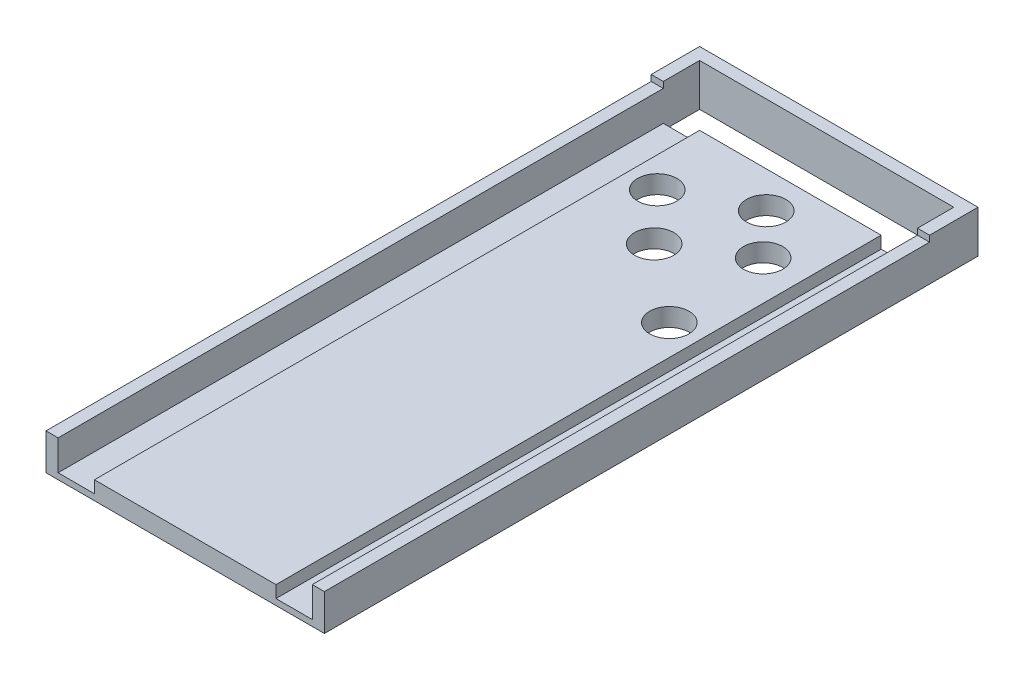
ISO-10303-21;
HEADER;
FILE_DESCRIPTION(('STEP AP214'),'2;1');
FILE_NAME('part.step','',(''),(''),'','','');
FILE_SCHEMA(('AUTOMOTIVE_DESIGN { 1 0 10303 214 1 1 1 1 }'));
ENDSEC;
DATA;
#1=APPLICATION_CONTEXT('core data for automotive mechanical design processes');
#2=APPLICATION_PROTOCOL_DEFINITION('international standard','automotive_design',2000,#1);
#3=PRODUCT_CONTEXT('',#1,'mechanical');
#4=PRODUCT('Part','Part','',(#3));
#5=PRODUCT_RELATED_PRODUCT_CATEGORY('part','',(#4));
#6=PRODUCT_DEFINITION_FORMATION('','',#4);
#7=PRODUCT_DEFINITION_CONTEXT('part definition',#1,'design');
#8=PRODUCT_DEFINITION('design','',#6,#7);
#9=PRODUCT_DEFINITION_SHAPE('','',#8);
#10=(LENGTH_UNIT() NAMED_UNIT(*) SI_UNIT(.MILLI.,.METRE.));
#11=(NAMED_UNIT(*) PLANE_ANGLE_UNIT() SI_UNIT($,.RADIAN.));
#12=(NAMED_UNIT(*) SI_UNIT($,.STERADIAN.) SOLID_ANGLE_UNIT());
#13=UNCERTAINTY_MEASURE_WITH_UNIT(LENGTH_MEASURE(1.E-05),#10,'distance_accuracy_value','');
#14=(GEOMETRIC_REPRESENTATION_CONTEXT(3) GLOBAL_UNCERTAINTY_ASSIGNED_CONTEXT((#13)) GLOBAL_UNIT_ASSIGNED_CONTEXT((#10,
#11,#12)) REPRESENTATION_CONTEXT('',''));
#15=CARTESIAN_POINT('',(0.,0.,0.));
#16=DIRECTION('',(0.,0.,1.));
#17=DIRECTION('',(1.,0.,0.));
#18=AXIS2_PLACEMENT_3D('',#15,#16,#17);
#19=CARTESIAN_POINT('',(-0.08,0.07,-1.));
#20=DIRECTION('',(0.,0.,-1.));
#21=DIRECTION('',(-1.,0.,0.));
#22=AXIS2_PLACEMENT_3D('',#19,#20,#21);
#23=PLANE('',#22);
#24=DIRECTION('',(-1.,0.,0.));
#25=VECTOR('',#24,1.);
#26=CARTESIAN_POINT('',(0.,0.06,-1.));
#27=LINE('',#26,#25);
#28=CARTESIAN_POINT('',(-0.0599999999999999,0.06,-1.));
#29=VERTEX_POINT('',#28);
#30=CARTESIAN_POINT('',(-0.08,0.06,-1.));
#31=VERTEX_POINT('',#30);
#32=EDGE_CURVE('E289',#29,#31,#27,.T.);
#33=ORIENTED_EDGE('',*,*,#32,.F.);
#34=DIRECTION('',(0.,1.,0.));
#35=VECTOR('',#34,1.);
#36=CARTESIAN_POINT('',(-0.0599999999999999,-0.000999999999999997,-1.));
#37=LINE('',#36,#35);
#38=CARTESIAN_POINT('',(-0.0599999999999999,0.07,-1.));
#39=VERTEX_POINT('',#38);
#40=EDGE_CURVE('E179',#29,#39,#37,.T.);
#41=ORIENTED_EDGE('',*,*,#40,.T.);
#42=DIRECTION('',(1.,0.,0.));
#43=VECTOR('',#42,1.);
#44=CARTESIAN_POINT('',(-0.08,0.07,-1.));
#45=LINE('',#44,#43);
#46=CARTESIAN_POINT('',(-0.08,0.07,-1.));
#47=VERTEX_POINT('',#46);
#48=EDGE_CURVE('E222',#47,#39,#45,.T.);
#49=ORIENTED_EDGE('',*,*,#48,.F.);
#50=DIRECTION('',(0.,-1.,0.));
#51=VECTOR('',#50,1.);
#52=CARTESIAN_POINT('',(-0.08,0.07,-1.));
#53=LINE('',#52,#51);
#54=EDGE_CURVE('E247',#47,#31,#53,.T.);
#55=ORIENTED_EDGE('',*,*,#54,.T.);
#56=EDGE_LOOP('',(#33,#41,#49,#55));
#57=FACE_BOUND('',#56,.T.);
#58=ADVANCED_FACE('F41',(#57),#23,.F.);
#59=CARTESIAN_POINT('',(0.,0.03,0.));
#60=DIRECTION('',(0.,0.,-1.));
#61=DIRECTION('',(-1.,0.,0.));
#62=AXIS2_PLACEMENT_3D('',#59,#60,#61);
#63=PLANE('',#62);
#64=DIRECTION('',(1.,0.,0.));
#65=VECTOR('',#64,1.);
#66=CARTESIAN_POINT('',(0.,0.,0.));
#67=LINE('',#66,#65);
#68=CARTESIAN_POINT('',(-0.08,0.,0.));
#69=VERTEX_POINT('',#68);
#70=CARTESIAN_POINT('',(0.38,0.,0.));
#71=VERTEX_POINT('',#70);
#72=EDGE_CURVE('E329',#69,#71,#67,.T.);
#73=ORIENTED_EDGE('',*,*,#72,.T.);
#74=DIRECTION('',(0.,-1.,0.));
#75=VECTOR('',#74,1.);
#76=CARTESIAN_POINT('',(0.38,0.06,0.));
#77=LINE('',#76,#75);
#78=CARTESIAN_POINT('',(0.38,0.06,0.));
#79=VERTEX_POINT('',#78);
#80=EDGE_CURVE('E272',#79,#71,#77,.T.);
#81=ORIENTED_EDGE('',*,*,#80,.F.);
#82=DIRECTION('',(1.,0.,0.));
#83=VECTOR('',#82,1.);
#84=CARTESIAN_POINT('',(0.,0.06,0.));
#85=LINE('',#84,#83);
#86=CARTESIAN_POINT('',(0.36,0.06,0.));
#87=VERTEX_POINT('',#86);
#88=EDGE_CURVE('E252',#87,#79,#85,.T.);
#89=ORIENTED_EDGE('',*,*,#88,.F.);
#90=DIRECTION('',(0.,-1.,0.));
#91=VECTOR('',#90,1.);
#92=CARTESIAN_POINT('',(0.36,0.06,0.));
#93=LINE('',#92,#91);
#94=CARTESIAN_POINT('',(0.36,0.01,0.));
#95=VERTEX_POINT('',#94);
#96=EDGE_CURVE('E266',#87,#95,#93,.T.);
#97=ORIENTED_EDGE('',*,*,#96,.T.);
#98=DIRECTION('',(1.,0.,0.));
#99=VECTOR('',#98,1.);
#100=CARTESIAN_POINT('',(0.,0.01,0.));
#101=LINE('',#100,#99);
#102=CARTESIAN_POINT('',(0.3,0.01,0.));
#103=VERTEX_POINT('',#102);
#104=EDGE_CURVE('E301',#103,#95,#101,.T.);
#105=ORIENTED_EDGE('',*,*,#104,.F.);
#106=DIRECTION('',(0.,-1.,0.));
#107=VECTOR('',#106,1.);
#108=CARTESIAN_POINT('',(0.3,0.03,0.));
#109=LINE('',#108,#107);
#110=CARTESIAN_POINT('',(0.3,0.03,0.));
#111=VERTEX_POINT('',#110);
#112=EDGE_CURVE('E11',#111,#103,#109,.T.);
#113=ORIENTED_EDGE('',*,*,#112,.F.);
#114=DIRECTION('',(1.,0.,0.));
#115=VECTOR('',#114,1.);
#116=CARTESIAN_POINT('',(0.,0.03,0.));
#117=LINE('',#116,#115);
#118=CARTESIAN_POINT('',(0.,0.03,0.));
#119=VERTEX_POINT('',#118);
#120=EDGE_CURVE('E330',#119,#111,#117,.T.);
#121=ORIENTED_EDGE('',*,*,#120,.F.);
#122=DIRECTION('',(0.,-1.,0.));
#123=VECTOR('',#122,1.);
#124=CARTESIAN_POINT('',(0.,0.03,0.));
#125=LINE('',#124,#123);
#126=CARTESIAN_POINT('',(0.,0.01,0.));
#127=VERTEX_POINT('',#126);
#128=EDGE_CURVE('E345',#119,#127,#125,.T.);
#129=ORIENTED_EDGE('',*,*,#128,.T.);
#130=DIRECTION('',(-1.,0.,0.));
#131=VECTOR('',#130,1.);
#132=CARTESIAN_POINT('',(0.,0.01,0.));
#133=LINE('',#132,#131);
#134=CARTESIAN_POINT('',(-0.06,0.01,0.));
#135=VERTEX_POINT('',#134);
#136=EDGE_CURVE('E318',#127,#135,#133,.T.);
#137=ORIENTED_EDGE('',*,*,#136,.T.);
#138=DIRECTION('',(0.,-1.,0.));
#139=VECTOR('',#138,1.);
#140=CARTESIAN_POINT('',(-0.06,0.06,0.));
#141=LINE('',#140,#139);
#142=CARTESIAN_POINT('',(-0.06,0.06,0.));
#143=VERTEX_POINT('',#142);
#144=EDGE_CURVE('E292',#143,#135,#141,.T.);
#145=ORIENTED_EDGE('',*,*,#144,.F.);
#146=DIRECTION('',(-1.,0.,0.));
#147=VECTOR('',#146,1.);
#148=CARTESIAN_POINT('',(0.,0.06,0.));
#149=LINE('',#148,#147);
#150=CARTESIAN_POINT('',(-0.08,0.06,0.));
#151=VERTEX_POINT('',#150);
#152=EDGE_CURVE('E281',#143,#151,#149,.T.);
#153=ORIENTED_EDGE('',*,*,#152,.T.);
#154=DIRECTION('',(0.,-1.,0.));
#155=VECTOR('',#154,1.);
#156=CARTESIAN_POINT('',(-0.08,0.06,0.));
#157=LINE('',#156,#155);
#158=EDGE_CURVE('E297',#151,#69,#157,.T.);
#159=ORIENTED_EDGE('',*,*,#158,.T.);
#160=EDGE_LOOP('',(#73,#81,#89,#97,#105,#113,#121,#129,#137,#145,#153,#159));
#161=FACE_BOUND('',#160,.T.);
#162=ADVANCED_FACE('F43',(#161),#63,.F.);
#163=CARTESIAN_POINT('',(0.3,0.03,0.));
#164=DIRECTION('',(-1.,0.,0.));
#165=DIRECTION('',(0.,0.,1.));
#166=AXIS2_PLACEMENT_3D('',#163,#164,#165);
#167=PLANE('',#166);
#168=ORIENTED_EDGE('',*,*,#112,.T.);
#169=DIRECTION('',(0.,0.,-1.));
#170=VECTOR('',#169,1.);
#171=CARTESIAN_POINT('',(0.3,0.01,0.));
#172=LINE('',#171,#170);
#173=CARTESIAN_POINT('',(0.3,0.01,-1.));
#174=VERTEX_POINT('',#173);
#175=EDGE_CURVE('E312',#103,#174,#172,.T.);
#176=ORIENTED_EDGE('',*,*,#175,.T.);
#177=DIRECTION('',(0.,-1.,0.));
#178=VECTOR('',#177,1.);
#179=CARTESIAN_POINT('',(0.3,0.03,-1.));
#180=LINE('',#179,#178);
#181=CARTESIAN_POINT('',(0.3,0.03,-1.));
#182=VERTEX_POINT('',#181);
#183=EDGE_CURVE('E50',#182,#174,#180,.T.);
#184=ORIENTED_EDGE('',*,*,#183,.F.);
#185=DIRECTION('',(0.,0.,-1.));
#186=VECTOR('',#185,1.);
#187=CARTESIAN_POINT('',(0.3,0.03,0.));
#188=LINE('',#187,#186);
#189=EDGE_CURVE('E334',#111,#182,#188,.T.);
#190=ORIENTED_EDGE('',*,*,#189,.F.);
#191=EDGE_LOOP('',(#168,#176,#184,#190));
#192=FACE_BOUND('',#191,.T.);
#193=ADVANCED_FACE('F362',(#192),#167,.F.);
#194=CARTESIAN_POINT('',(0.,0.03,0.));
#195=DIRECTION('',(-1.,0.,0.));
#196=DIRECTION('',(0.,0.,1.));
#197=AXIS2_PLACEMENT_3D('',#194,#195,#196);
#198=PLANE('',#197);
#199=DIRECTION('',(0.,0.,-1.));
#200=VECTOR('',#199,1.);
#201=CARTESIAN_POINT('',(0.,0.01,0.));
#202=LINE('',#201,#200);
#203=CARTESIAN_POINT('',(0.,0.01,-1.));
#204=VERTEX_POINT('',#203);
#205=EDGE_CURVE('E322',#127,#204,#202,.T.);
#206=ORIENTED_EDGE('',*,*,#205,.F.);
#207=ORIENTED_EDGE('',*,*,#128,.F.);
#208=DIRECTION('',(0.,0.,-1.));
#209=VECTOR('',#208,1.);
#210=CARTESIAN_POINT('',(0.,0.03,0.));
#211=LINE('',#210,#209);
#212=CARTESIAN_POINT('',(0.,0.03,-1.));
#213=VERTEX_POINT('',#212);
#214=EDGE_CURVE('E341',#119,#213,#211,.T.);
#215=ORIENTED_EDGE('',*,*,#214,.T.);
#216=DIRECTION('',(0.,-1.,0.));
#217=VECTOR('',#216,1.);
#218=CARTESIAN_POINT('',(0.,0.03,-1.));
#219=LINE('',#218,#217);
#220=EDGE_CURVE('E351',#213,#204,#219,.T.);
#221=ORIENTED_EDGE('',*,*,#220,.T.);
#222=EDGE_LOOP('',(#206,#207,#215,#221));
#223=FACE_BOUND('',#222,.T.);
#224=ADVANCED_FACE('F408',(#223),#198,.T.);
#225=CARTESIAN_POINT('',(0.,0.03,0.));
#226=DIRECTION('',(0.,1.,0.));
#227=DIRECTION('',(0.,0.,1.));
#228=AXIS2_PLACEMENT_3D('',#225,#226,#227);
#229=PLANE('',#228);
#230=CARTESIAN_POINT('',(0.05,0.03,-0.880000000000001));
#231=DIRECTION('',(0.,1.,0.));
#232=DIRECTION('',(0.,0.,1.));
#233=AXIS2_PLACEMENT_3D('',#230,#231,#232);
#234=CIRCLE('',#233,0.0325000000000002);
#235=CARTESIAN_POINT('',(0.05,0.03,-0.8475));
#236=VERTEX_POINT('',#235);
#237=EDGE_CURVE('E666',#236,#236,#234,.T.);
#238=ORIENTED_EDGE('',*,*,#237,.F.);
#239=EDGE_LOOP('',(#238));
#240=FACE_BOUND('',#239,.T.);
#241=CARTESIAN_POINT('',(0.25,0.03,-0.700000000000001));
#242=DIRECTION('',(0.,1.,0.));
#243=DIRECTION('',(0.,0.,1.));
#244=AXIS2_PLACEMENT_3D('',#241,#242,#243);
#245=CIRCLE('',#244,0.0325);
#246=CARTESIAN_POINT('',(0.25,0.03,-0.667500000000001));
#247=VERTEX_POINT('',#246);
#248=EDGE_CURVE('E687',#247,#247,#245,.T.);
#249=ORIENTED_EDGE('',*,*,#248,.F.);
#250=EDGE_LOOP('',(#249));
#251=FACE_BOUND('',#250,.T.);
#252=CARTESIAN_POINT('',(0.17,0.03,-0.940000000000002));
#253=DIRECTION('',(0.,1.,0.));
#254=DIRECTION('',(0.,0.,1.));
#255=AXIS2_PLACEMENT_3D('',#252,#253,#254);
#256=CIRCLE('',#255,0.0325);
#257=CARTESIAN_POINT('',(0.17,0.03,-0.907500000000002));
#258=VERTEX_POINT('',#257);
#259=EDGE_CURVE('E677',#258,#258,#256,.T.);
#260=ORIENTED_EDGE('',*,*,#259,.F.);
#261=EDGE_LOOP('',(#260));
#262=FACE_BOUND('',#261,.T.);
#263=CARTESIAN_POINT('',(0.235,0.03,-0.870000000000001));
#264=DIRECTION('',(0.,1.,0.));
#265=DIRECTION('',(0.,0.,1.));
#266=AXIS2_PLACEMENT_3D('',#263,#264,#265);
#267=CIRCLE('',#266,0.0325);
#268=CARTESIAN_POINT('',(0.235,0.03,-0.837500000000001));
#269=VERTEX_POINT('',#268);
#270=EDGE_CURVE('E686',#269,#269,#267,.T.);
#271=ORIENTED_EDGE('',*,*,#270,.F.);
#272=EDGE_LOOP('',(#271));
#273=FACE_BOUND('',#272,.T.);
#274=CARTESIAN_POINT('',(0.125,0.03,-0.8));
#275=DIRECTION('',(0.,1.,0.));
#276=DIRECTION('',(0.,0.,1.));
#277=AXIS2_PLACEMENT_3D('',#274,#275,#276);
#278=CIRCLE('',#277,0.0325000000000001);
#279=CARTESIAN_POINT('',(0.125,0.03,-0.7675));
#280=VERTEX_POINT('',#279);
#281=EDGE_CURVE('E694',#280,#280,#278,.T.);
#282=ORIENTED_EDGE('',*,*,#281,.F.);
#283=EDGE_LOOP('',(#282));
#284=FACE_BOUND('',#283,.T.);
#285=ORIENTED_EDGE('',*,*,#120,.T.);
#286=ORIENTED_EDGE('',*,*,#189,.T.);
#287=DIRECTION('',(1.,0.,0.));
#288=VECTOR('',#287,1.);
#289=CARTESIAN_POINT('',(0.,0.03,-1.));
#290=LINE('',#289,#288);
#291=EDGE_CURVE('E338',#213,#182,#290,.T.);
#292=ORIENTED_EDGE('',*,*,#291,.F.);
#293=ORIENTED_EDGE('',*,*,#214,.F.);
#294=EDGE_LOOP('',(#285,#286,#292,#293));
#295=FACE_BOUND('',#294,.T.);
#296=ADVANCED_FACE('F410',(#240,#251,#262,#273,#284,#295),#229,.T.);
#297=CARTESIAN_POINT('',(0.,0.,0.));
#298=DIRECTION('',(0.,1.,0.));
#299=DIRECTION('',(0.,0.,1.));
#300=AXIS2_PLACEMENT_3D('',#297,#298,#299);
#301=PLANE('',#300);
#302=CARTESIAN_POINT('',(0.05,0.,-0.880000000000001));
#303=DIRECTION('',(0.,1.,0.));
#304=DIRECTION('',(0.,0.,1.));
#305=AXIS2_PLACEMENT_3D('',#302,#303,#304);
#306=CIRCLE('',#305,0.0325000000000002);
#307=CARTESIAN_POINT('',(0.05,0.,-0.8475));
#308=VERTEX_POINT('',#307);
#309=EDGE_CURVE('E669',#308,#308,#306,.F.);
#310=ORIENTED_EDGE('',*,*,#309,.F.);
#311=EDGE_LOOP('',(#310));
#312=FACE_BOUND('',#311,.T.);
#313=CARTESIAN_POINT('',(0.25,0.,-0.700000000000001));
#314=DIRECTION('',(0.,1.,0.));
#315=DIRECTION('',(0.,0.,1.));
#316=AXIS2_PLACEMENT_3D('',#313,#314,#315);
#317=CIRCLE('',#316,0.0325);
#318=CARTESIAN_POINT('',(0.25,0.,-0.667500000000001));
#319=VERTEX_POINT('',#318);
#320=EDGE_CURVE('E682',#319,#319,#317,.F.);
#321=ORIENTED_EDGE('',*,*,#320,.F.);
#322=EDGE_LOOP('',(#321));
#323=FACE_BOUND('',#322,.T.);
#324=CARTESIAN_POINT('',(0.17,0.,-0.940000000000002));
#325=DIRECTION('',(0.,1.,0.));
#326=DIRECTION('',(0.,0.,1.));
#327=AXIS2_PLACEMENT_3D('',#324,#325,#326);
#328=CIRCLE('',#327,0.0325);
#329=CARTESIAN_POINT('',(0.17,0.,-0.907500000000002));
#330=VERTEX_POINT('',#329);
#331=EDGE_CURVE('E681',#330,#330,#328,.F.);
#332=ORIENTED_EDGE('',*,*,#331,.F.);
#333=EDGE_LOOP('',(#332));
#334=FACE_BOUND('',#333,.T.);
#335=CARTESIAN_POINT('',(0.235,0.,-0.870000000000001));
#336=DIRECTION('',(0.,1.,0.));
#337=DIRECTION('',(0.,0.,1.));
#338=AXIS2_PLACEMENT_3D('',#335,#336,#337);
#339=CIRCLE('',#338,0.0325);
#340=CARTESIAN_POINT('',(0.235,0.,-0.837500000000001));
#341=VERTEX_POINT('',#340);
#342=EDGE_CURVE('E698',#341,#341,#339,.F.);
#343=ORIENTED_EDGE('',*,*,#342,.F.);
#344=EDGE_LOOP('',(#343));
#345=FACE_BOUND('',#344,.T.);
#346=CARTESIAN_POINT('',(0.125,0.,-0.8));
#347=DIRECTION('',(0.,1.,0.));
#348=DIRECTION('',(0.,0.,1.));
#349=AXIS2_PLACEMENT_3D('',#346,#347,#348);
#350=CIRCLE('',#349,0.0325000000000001);
#351=CARTESIAN_POINT('',(0.125,0.,-0.7675));
#352=VERTEX_POINT('',#351);
#353=EDGE_CURVE('E674',#352,#352,#350,.F.);
#354=ORIENTED_EDGE('',*,*,#353,.F.);
#355=EDGE_LOOP('',(#354));
#356=FACE_BOUND('',#355,.T.);
#357=DIRECTION('',(1.,0.,0.));
#358=VECTOR('',#357,1.);
#359=CARTESIAN_POINT('',(-0.0599999999999999,0.,-1.06));
#360=LINE('',#359,#358);
#361=CARTESIAN_POINT('',(-0.0599999999999999,0.,-1.06));
#362=VERTEX_POINT('',#361);
#363=CARTESIAN_POINT('',(0.36,0.,-1.06));
#364=VERTEX_POINT('',#363);
#365=EDGE_CURVE('E193',#362,#364,#360,.T.);
#366=ORIENTED_EDGE('',*,*,#365,.F.);
#367=DIRECTION('',(0.,0.,-1.));
#368=VECTOR('',#367,1.);
#369=CARTESIAN_POINT('',(-0.0599999999999999,0.,-1.));
#370=LINE('',#369,#368);
#371=CARTESIAN_POINT('',(-0.0599999999999999,0.,-1.));
#372=VERTEX_POINT('',#371);
#373=EDGE_CURVE('E173',#372,#362,#370,.T.);
#374=ORIENTED_EDGE('',*,*,#373,.F.);
#375=DIRECTION('',(-1.,0.,0.));
#376=VECTOR('',#375,1.);
#377=CARTESIAN_POINT('',(-0.0599999999999999,0.,-1.));
#378=LINE('',#377,#376);
#379=CARTESIAN_POINT('',(0.36,0.,-1.));
#380=VERTEX_POINT('',#379);
#381=EDGE_CURVE('E182',#380,#372,#378,.T.);
#382=ORIENTED_EDGE('',*,*,#381,.F.);
#383=DIRECTION('',(0.,0.,1.));
#384=VECTOR('',#383,1.);
#385=CARTESIAN_POINT('',(0.36,0.,-1.));
#386=LINE('',#385,#384);
#387=EDGE_CURVE('E57',#364,#380,#386,.T.);
#388=ORIENTED_EDGE('',*,*,#387,.F.);
#389=EDGE_LOOP('',(#366,#374,#382,#388));
#390=FACE_BOUND('',#389,.T.);
#391=ORIENTED_EDGE('',*,*,#72,.F.);
#392=DIRECTION('',(0.,0.,-1.));
#393=VECTOR('',#392,1.);
#394=CARTESIAN_POINT('',(-0.08,0.,0.));
#395=LINE('',#394,#393);
#396=CARTESIAN_POINT('',(-0.08,0.,-1.08));
#397=VERTEX_POINT('',#396);
#398=EDGE_CURVE('E276',#69,#397,#395,.T.);
#399=ORIENTED_EDGE('',*,*,#398,.T.);
#400=DIRECTION('',(-1.,0.,0.));
#401=VECTOR('',#400,1.);
#402=CARTESIAN_POINT('',(-0.08,0.,-1.08));
#403=LINE('',#402,#401);
#404=CARTESIAN_POINT('',(0.380000000000001,0.,-1.08));
#405=VERTEX_POINT('',#404);
#406=EDGE_CURVE('E187',#405,#397,#403,.T.);
#407=ORIENTED_EDGE('',*,*,#406,.F.);
#408=DIRECTION('',(0.,0.,-1.));
#409=VECTOR('',#408,1.);
#410=CARTESIAN_POINT('',(0.38,0.,0.));
#411=LINE('',#410,#409);
#412=EDGE_CURVE('E251',#71,#405,#411,.T.);
#413=ORIENTED_EDGE('',*,*,#412,.F.);
#414=EDGE_LOOP('',(#391,#399,#407,#413));
#415=FACE_BOUND('',#414,.T.);
#416=ADVANCED_FACE('F190',(#312,#323,#334,#345,#356,#390,#415),#301,.F.);
#417=CARTESIAN_POINT('',(0.,0.01,0.));
#418=DIRECTION('',(0.,1.,0.));
#419=DIRECTION('',(0.,0.,1.));
#420=AXIS2_PLACEMENT_3D('',#417,#418,#419);
#421=PLANE('',#420);
#422=DIRECTION('',(0.,0.,-1.));
#423=VECTOR('',#422,1.);
#424=CARTESIAN_POINT('',(-0.06,0.01,0.));
#425=LINE('',#424,#423);
#426=CARTESIAN_POINT('',(-0.0599999999999999,0.01,-1.));
#427=VERTEX_POINT('',#426);
#428=EDGE_CURVE('E175',#135,#427,#425,.T.);
#429=ORIENTED_EDGE('',*,*,#428,.F.);
#430=ORIENTED_EDGE('',*,*,#136,.F.);
#431=ORIENTED_EDGE('',*,*,#205,.T.);
#432=DIRECTION('',(-1.,0.,0.));
#433=VECTOR('',#432,1.);
#434=CARTESIAN_POINT('',(0.,0.01,-1.));
#435=LINE('',#434,#433);
#436=EDGE_CURVE('E326',#204,#427,#435,.T.);
#437=ORIENTED_EDGE('',*,*,#436,.T.);
#438=EDGE_LOOP('',(#429,#430,#431,#437));
#439=FACE_BOUND('',#438,.T.);
#440=ADVANCED_FACE('F406',(#439),#421,.T.);
#441=CARTESIAN_POINT('',(0.,0.01,0.));
#442=DIRECTION('',(0.,1.,0.));
#443=DIRECTION('',(0.,0.,1.));
#444=AXIS2_PLACEMENT_3D('',#441,#442,#443);
#445=PLANE('',#444);
#446=ORIENTED_EDGE('',*,*,#104,.T.);
#447=DIRECTION('',(0.,0.,-1.));
#448=VECTOR('',#447,1.);
#449=CARTESIAN_POINT('',(0.36,0.01,0.));
#450=LINE('',#449,#448);
#451=CARTESIAN_POINT('',(0.36,0.01,-1.));
#452=VERTEX_POINT('',#451);
#453=EDGE_CURVE('E305',#95,#452,#450,.T.);
#454=ORIENTED_EDGE('',*,*,#453,.T.);
#455=DIRECTION('',(1.,0.,0.));
#456=VECTOR('',#455,1.);
#457=CARTESIAN_POINT('',(0.,0.01,-1.));
#458=LINE('',#457,#456);
#459=EDGE_CURVE('E309',#174,#452,#458,.T.);
#460=ORIENTED_EDGE('',*,*,#459,.F.);
#461=ORIENTED_EDGE('',*,*,#175,.F.);
#462=EDGE_LOOP('',(#446,#454,#460,#461));
#463=FACE_BOUND('',#462,.T.);
#464=ADVANCED_FACE('F361',(#463),#445,.T.);
#465=CARTESIAN_POINT('',(-0.06,0.06,0.));
#466=DIRECTION('',(-1.,0.,0.));
#467=DIRECTION('',(0.,0.,1.));
#468=AXIS2_PLACEMENT_3D('',#465,#466,#467);
#469=PLANE('',#468);
#470=ORIENTED_EDGE('',*,*,#144,.T.);
#471=ORIENTED_EDGE('',*,*,#428,.T.);
#472=EDGE_CURVE('E168',#372,#427,#37,.T.);
#473=ORIENTED_EDGE('',*,*,#472,.F.);
#474=ORIENTED_EDGE('',*,*,#373,.T.);
#475=DIRECTION('',(0.,1.,0.));
#476=VECTOR('',#475,1.);
#477=CARTESIAN_POINT('',(-0.0599999999999999,-0.000999999999999997,-1.06));
#478=LINE('',#477,#476);
#479=CARTESIAN_POINT('',(-0.0599999999999999,0.07,-1.06));
#480=VERTEX_POINT('',#479);
#481=EDGE_CURVE('E188',#362,#480,#478,.T.);
#482=ORIENTED_EDGE('',*,*,#481,.T.);
#483=DIRECTION('',(0.,0.,1.));
#484=VECTOR('',#483,1.);
#485=CARTESIAN_POINT('',(-0.0599999999999999,0.07,-1.));
#486=LINE('',#485,#484);
#487=EDGE_CURVE('E195',#480,#39,#486,.T.);
#488=ORIENTED_EDGE('',*,*,#487,.T.);
#489=ORIENTED_EDGE('',*,*,#40,.F.);
#490=DIRECTION('',(0.,0.,-1.));
#491=VECTOR('',#490,1.);
#492=CARTESIAN_POINT('',(-0.06,0.06,0.));
#493=LINE('',#492,#491);
#494=EDGE_CURVE('E285',#143,#29,#493,.T.);
#495=ORIENTED_EDGE('',*,*,#494,.F.);
#496=EDGE_LOOP('',(#470,#471,#473,#474,#482,#488,#489,#495));
#497=FACE_BOUND('',#496,.T.);
#498=ADVANCED_FACE('F171',(#497),#469,.F.);
#499=CARTESIAN_POINT('',(-0.08,0.06,0.));
#500=DIRECTION('',(-1.,0.,0.));
#501=DIRECTION('',(0.,0.,1.));
#502=AXIS2_PLACEMENT_3D('',#499,#500,#501);
#503=PLANE('',#502);
#504=ORIENTED_EDGE('',*,*,#398,.F.);
#505=ORIENTED_EDGE('',*,*,#158,.F.);
#506=DIRECTION('',(0.,0.,-1.));
#507=VECTOR('',#506,1.);
#508=CARTESIAN_POINT('',(-0.08,0.06,0.));
#509=LINE('',#508,#507);
#510=EDGE_CURVE('E277',#151,#31,#509,.T.);
#511=ORIENTED_EDGE('',*,*,#510,.T.);
#512=ORIENTED_EDGE('',*,*,#54,.F.);
#513=DIRECTION('',(0.,0.,1.));
#514=VECTOR('',#513,1.);
#515=CARTESIAN_POINT('',(-0.08,0.07,-1.));
#516=LINE('',#515,#514);
#517=CARTESIAN_POINT('',(-0.08,0.07,-1.08));
#518=VERTEX_POINT('',#517);
#519=EDGE_CURVE('E217',#518,#47,#516,.T.);
#520=ORIENTED_EDGE('',*,*,#519,.F.);
#521=DIRECTION('',(0.,-1.,0.));
#522=VECTOR('',#521,1.);
#523=CARTESIAN_POINT('',(-0.08,0.07,-1.08));
#524=LINE('',#523,#522);
#525=EDGE_CURVE('E232',#518,#397,#524,.T.);
#526=ORIENTED_EDGE('',*,*,#525,.T.);
#527=EDGE_LOOP('',(#504,#505,#511,#512,#520,#526));
#528=FACE_BOUND('',#527,.T.);
#529=ADVANCED_FACE('F399',(#528),#503,.T.);
#530=CARTESIAN_POINT('',(0.,0.06,0.));
#531=DIRECTION('',(0.,1.,0.));
#532=DIRECTION('',(0.,0.,1.));
#533=AXIS2_PLACEMENT_3D('',#530,#531,#532);
#534=PLANE('',#533);
#535=ORIENTED_EDGE('',*,*,#510,.F.);
#536=ORIENTED_EDGE('',*,*,#152,.F.);
#537=ORIENTED_EDGE('',*,*,#494,.T.);
#538=ORIENTED_EDGE('',*,*,#32,.T.);
#539=EDGE_LOOP('',(#535,#536,#537,#538));
#540=FACE_BOUND('',#539,.T.);
#541=ADVANCED_FACE('F403',(#540),#534,.T.);
#542=CARTESIAN_POINT('',(0.36,0.06,0.));
#543=DIRECTION('',(-1.,0.,0.));
#544=DIRECTION('',(0.,0.,1.));
#545=AXIS2_PLACEMENT_3D('',#542,#543,#544);
#546=PLANE('',#545);
#547=ORIENTED_EDGE('',*,*,#453,.F.);
#548=ORIENTED_EDGE('',*,*,#96,.F.);
#549=DIRECTION('',(0.,0.,-1.));
#550=VECTOR('',#549,1.);
#551=CARTESIAN_POINT('',(0.36,0.06,0.));
#552=LINE('',#551,#550);
#553=CARTESIAN_POINT('',(0.36,0.06,-1.));
#554=VERTEX_POINT('',#553);
#555=EDGE_CURVE('E263',#87,#554,#552,.T.);
#556=ORIENTED_EDGE('',*,*,#555,.T.);
#557=DIRECTION('',(0.,1.,0.));
#558=VECTOR('',#557,1.);
#559=CARTESIAN_POINT('',(0.36,-0.000999999999999997,-1.));
#560=LINE('',#559,#558);
#561=CARTESIAN_POINT('',(0.36,0.07,-1.));
#562=VERTEX_POINT('',#561);
#563=EDGE_CURVE('E64',#554,#562,#560,.T.);
#564=ORIENTED_EDGE('',*,*,#563,.T.);
#565=DIRECTION('',(0.,0.,-1.));
#566=VECTOR('',#565,1.);
#567=CARTESIAN_POINT('',(0.36,0.07,-1.));
#568=LINE('',#567,#566);
#569=CARTESIAN_POINT('',(0.36,0.07,-1.06));
#570=VERTEX_POINT('',#569);
#571=EDGE_CURVE('E199',#562,#570,#568,.T.);
#572=ORIENTED_EDGE('',*,*,#571,.T.);
#573=DIRECTION('',(0.,1.,0.));
#574=VECTOR('',#573,1.);
#575=CARTESIAN_POINT('',(0.36,-0.000999999999999997,-1.06));
#576=LINE('',#575,#574);
#577=EDGE_CURVE('E212',#364,#570,#576,.T.);
#578=ORIENTED_EDGE('',*,*,#577,.F.);
#579=ORIENTED_EDGE('',*,*,#387,.T.);
#580=EDGE_CURVE('E184',#380,#452,#560,.T.);
#581=ORIENTED_EDGE('',*,*,#580,.T.);
#582=EDGE_LOOP('',(#547,#548,#556,#564,#572,#578,#579,#581));
#583=FACE_BOUND('',#582,.T.);
#584=ADVANCED_FACE('F370',(#583),#546,.T.);
#585=CARTESIAN_POINT('',(0.38,0.06,0.));
#586=DIRECTION('',(-1.,0.,0.));
#587=DIRECTION('',(0.,0.,1.));
#588=AXIS2_PLACEMENT_3D('',#585,#586,#587);
#589=PLANE('',#588);
#590=ORIENTED_EDGE('',*,*,#412,.T.);
#591=DIRECTION('',(0.,-1.,0.));
#592=VECTOR('',#591,1.);
#593=CARTESIAN_POINT('',(0.380000000000001,0.07,-1.08));
#594=LINE('',#593,#592);
#595=CARTESIAN_POINT('',(0.380000000000001,0.07,-1.08));
#596=VERTEX_POINT('',#595);
#597=EDGE_CURVE('E239',#596,#405,#594,.T.);
#598=ORIENTED_EDGE('',*,*,#597,.F.);
#599=DIRECTION('',(0.,0.,-1.));
#600=VECTOR('',#599,1.);
#601=CARTESIAN_POINT('',(0.38,0.07,-1.));
#602=LINE('',#601,#600);
#603=CARTESIAN_POINT('',(0.38,0.07,-1.));
#604=VERTEX_POINT('',#603);
#605=EDGE_CURVE('E226',#604,#596,#602,.T.);
#606=ORIENTED_EDGE('',*,*,#605,.F.);
#607=DIRECTION('',(0.,-1.,0.));
#608=VECTOR('',#607,1.);
#609=CARTESIAN_POINT('',(0.38,0.07,-1.));
#610=LINE('',#609,#608);
#611=CARTESIAN_POINT('',(0.38,0.06,-1.));
#612=VERTEX_POINT('',#611);
#613=EDGE_CURVE('E243',#604,#612,#610,.T.);
#614=ORIENTED_EDGE('',*,*,#613,.T.);
#615=DIRECTION('',(0.,0.,-1.));
#616=VECTOR('',#615,1.);
#617=CARTESIAN_POINT('',(0.38,0.06,0.));
#618=LINE('',#617,#616);
#619=EDGE_CURVE('E256',#79,#612,#618,.T.);
#620=ORIENTED_EDGE('',*,*,#619,.F.);
#621=ORIENTED_EDGE('',*,*,#80,.T.);
#622=EDGE_LOOP('',(#590,#598,#606,#614,#620,#621));
#623=FACE_BOUND('',#622,.T.);
#624=ADVANCED_FACE('F380',(#623),#589,.F.);
#625=CARTESIAN_POINT('',(0.,0.06,0.));
#626=DIRECTION('',(0.,1.,0.));
#627=DIRECTION('',(0.,0.,1.));
#628=AXIS2_PLACEMENT_3D('',#625,#626,#627);
#629=PLANE('',#628);
#630=ORIENTED_EDGE('',*,*,#88,.T.);
#631=ORIENTED_EDGE('',*,*,#619,.T.);
#632=DIRECTION('',(1.,0.,0.));
#633=VECTOR('',#632,1.);
#634=CARTESIAN_POINT('',(0.,0.06,-1.));
#635=LINE('',#634,#633);
#636=EDGE_CURVE('E259',#554,#612,#635,.T.);
#637=ORIENTED_EDGE('',*,*,#636,.F.);
#638=ORIENTED_EDGE('',*,*,#555,.F.);
#639=EDGE_LOOP('',(#630,#631,#637,#638));
#640=FACE_BOUND('',#639,.T.);
#641=ADVANCED_FACE('F373',(#640),#629,.T.);
#642=EDGE_CURVE('E221',#562,#604,#45,.T.);
#643=ORIENTED_EDGE('',*,*,#642,.F.);
#644=ORIENTED_EDGE('',*,*,#563,.F.);
#645=ORIENTED_EDGE('',*,*,#636,.T.);
#646=ORIENTED_EDGE('',*,*,#613,.F.);
#647=EDGE_LOOP('',(#643,#644,#645,#646));
#648=FACE_BOUND('',#647,.T.);
#649=ADVANCED_FACE('F377',(#648),#23,.F.);
#650=CARTESIAN_POINT('',(-0.08,0.07,-1.08));
#651=DIRECTION('',(0.,0.,1.));
#652=DIRECTION('',(1.,0.,0.));
#653=AXIS2_PLACEMENT_3D('',#650,#651,#652);
#654=PLANE('',#653);
#655=ORIENTED_EDGE('',*,*,#406,.T.);
#656=ORIENTED_EDGE('',*,*,#525,.F.);
#657=DIRECTION('',(-1.,0.,0.));
#658=VECTOR('',#657,1.);
#659=CARTESIAN_POINT('',(-0.08,0.07,-1.08));
#660=LINE('',#659,#658);
#661=EDGE_CURVE('E229',#596,#518,#660,.T.);
#662=ORIENTED_EDGE('',*,*,#661,.F.);
#663=ORIENTED_EDGE('',*,*,#597,.T.);
#664=EDGE_LOOP('',(#655,#656,#662,#663));
#665=FACE_BOUND('',#664,.T.);
#666=ADVANCED_FACE('F432',(#665),#654,.F.);
#667=CARTESIAN_POINT('',(0.,0.07,0.));
#668=DIRECTION('',(0.,-1.,0.));
#669=DIRECTION('',(0.,0.,-1.));
#670=AXIS2_PLACEMENT_3D('',#667,#668,#669);
#671=PLANE('',#670);
#672=ORIENTED_EDGE('',*,*,#48,.T.);
#673=ORIENTED_EDGE('',*,*,#487,.F.);
#674=DIRECTION('',(-1.,0.,0.));
#675=VECTOR('',#674,1.);
#676=CARTESIAN_POINT('',(-0.0599999999999999,0.07,-1.06));
#677=LINE('',#676,#675);
#678=EDGE_CURVE('E206',#570,#480,#677,.T.);
#679=ORIENTED_EDGE('',*,*,#678,.F.);
#680=ORIENTED_EDGE('',*,*,#571,.F.);
#681=ORIENTED_EDGE('',*,*,#642,.T.);
#682=ORIENTED_EDGE('',*,*,#605,.T.);
#683=ORIENTED_EDGE('',*,*,#661,.T.);
#684=ORIENTED_EDGE('',*,*,#519,.T.);
#685=EDGE_LOOP('',(#672,#673,#679,#680,#681,#682,#683,#684));
#686=FACE_BOUND('',#685,.T.);
#687=ADVANCED_FACE('F384',(#686),#671,.F.);
#688=CARTESIAN_POINT('',(-0.0599999999999999,-0.000999999999999997,-1.06));
#689=DIRECTION('',(0.,0.,-1.));
#690=DIRECTION('',(-1.,0.,0.));
#691=AXIS2_PLACEMENT_3D('',#688,#689,#690);
#692=PLANE('',#691);
#693=ORIENTED_EDGE('',*,*,#365,.T.);
#694=ORIENTED_EDGE('',*,*,#577,.T.);
#695=ORIENTED_EDGE('',*,*,#678,.T.);
#696=ORIENTED_EDGE('',*,*,#481,.F.);
#697=EDGE_LOOP('',(#693,#694,#695,#696));
#698=FACE_BOUND('',#697,.T.);
#699=ADVANCED_FACE('F595',(#698),#692,.F.);
#700=CARTESIAN_POINT('',(-0.0599999999999999,-0.000999999999999997,-1.));
#701=DIRECTION('',(0.,0.,1.));
#702=DIRECTION('',(1.,0.,0.));
#703=AXIS2_PLACEMENT_3D('',#700,#701,#702);
#704=PLANE('',#703);
#705=ORIENTED_EDGE('',*,*,#436,.F.);
#706=ORIENTED_EDGE('',*,*,#220,.F.);
#707=ORIENTED_EDGE('',*,*,#291,.T.);
#708=ORIENTED_EDGE('',*,*,#183,.T.);
#709=ORIENTED_EDGE('',*,*,#459,.T.);
#710=ORIENTED_EDGE('',*,*,#580,.F.);
#711=ORIENTED_EDGE('',*,*,#381,.T.);
#712=ORIENTED_EDGE('',*,*,#472,.T.);
#713=EDGE_LOOP('',(#705,#706,#707,#708,#709,#710,#711,#712));
#714=FACE_BOUND('',#713,.T.);
#715=ADVANCED_FACE('F183',(#714),#704,.F.);
#716=CARTESIAN_POINT('',(0.125,-0.000999999999999997,-0.8));
#717=DIRECTION('',(0.,1.,0.));
#718=DIRECTION('',(0.,0.,1.));
#719=AXIS2_PLACEMENT_3D('',#716,#717,#718);
#720=CYLINDRICAL_SURFACE('',#719,0.0325000000000001);
#721=ORIENTED_EDGE('',*,*,#281,.T.);
#722=EDGE_LOOP('',(#721));
#723=FACE_BOUND('',#722,.T.);
#724=ORIENTED_EDGE('',*,*,#353,.T.);
#725=EDGE_LOOP('',(#724));
#726=FACE_BOUND('',#725,.T.);
#727=ADVANCED_FACE('F610',(#723,#726),#720,.F.);
#728=CARTESIAN_POINT('',(0.235,-0.000999999999999997,-0.870000000000001));
#729=DIRECTION('',(0.,1.,0.));
#730=DIRECTION('',(0.,0.,1.));
#731=AXIS2_PLACEMENT_3D('',#728,#729,#730);
#732=CYLINDRICAL_SURFACE('',#731,0.0325);
#733=ORIENTED_EDGE('',*,*,#270,.T.);
#734=EDGE_LOOP('',(#733));
#735=FACE_BOUND('',#734,.T.);
#736=ORIENTED_EDGE('',*,*,#342,.T.);
#737=EDGE_LOOP('',(#736));
#738=FACE_BOUND('',#737,.T.);
#739=ADVANCED_FACE('F620',(#735,#738),#732,.F.);
#740=CARTESIAN_POINT('',(0.17,-0.000999999999999997,-0.940000000000002));
#741=DIRECTION('',(0.,1.,0.));
#742=DIRECTION('',(0.,0.,1.));
#743=AXIS2_PLACEMENT_3D('',#740,#741,#742);
#744=CYLINDRICAL_SURFACE('',#743,0.0325);
#745=ORIENTED_EDGE('',*,*,#259,.T.);
#746=EDGE_LOOP('',(#745));
#747=FACE_BOUND('',#746,.T.);
#748=ORIENTED_EDGE('',*,*,#331,.T.);
#749=EDGE_LOOP('',(#748));
#750=FACE_BOUND('',#749,.T.);
#751=ADVANCED_FACE('F627',(#747,#750),#744,.F.);
#752=CARTESIAN_POINT('',(0.25,-0.000999999999999997,-0.700000000000001));
#753=DIRECTION('',(0.,1.,0.));
#754=DIRECTION('',(0.,0.,1.));
#755=AXIS2_PLACEMENT_3D('',#752,#753,#754);
#756=CYLINDRICAL_SURFACE('',#755,0.0325);
#757=ORIENTED_EDGE('',*,*,#248,.T.);
#758=EDGE_LOOP('',(#757));
#759=FACE_BOUND('',#758,.T.);
#760=ORIENTED_EDGE('',*,*,#320,.T.);
#761=EDGE_LOOP('',(#760));
#762=FACE_BOUND('',#761,.T.);
#763=ADVANCED_FACE('F635',(#759,#762),#756,.F.);
#764=CARTESIAN_POINT('',(0.05,-0.000999999999999997,-0.880000000000001));
#765=DIRECTION('',(0.,1.,0.));
#766=DIRECTION('',(0.,0.,1.));
#767=AXIS2_PLACEMENT_3D('',#764,#765,#766);
#768=CYLINDRICAL_SURFACE('',#767,0.0325000000000002);
#769=ORIENTED_EDGE('',*,*,#237,.T.);
#770=EDGE_LOOP('',(#769));
#771=FACE_BOUND('',#770,.T.);
#772=ORIENTED_EDGE('',*,*,#309,.T.);
#773=EDGE_LOOP('',(#772));
#774=FACE_BOUND('',#773,.T.);
#775=ADVANCED_FACE('F643',(#771,#774),#768,.F.);
#776=CLOSED_SHELL('',(#58,#162,#193,#224,#296,#416,#440,#464,#498,#529,#541,#584,#624,#641,#649,
#666,#687,#699,#715,#727,#739,#751,#763,#775));
#777=MANIFOLD_SOLID_BREP('B2',#776);
#778=ADVANCED_BREP_SHAPE_REPRESENTATION('',(#18,#777),#14);
#779=SHAPE_DEFINITION_REPRESENTATION(#9,#778);
ENDSEC;
END-ISO-10303-21;
